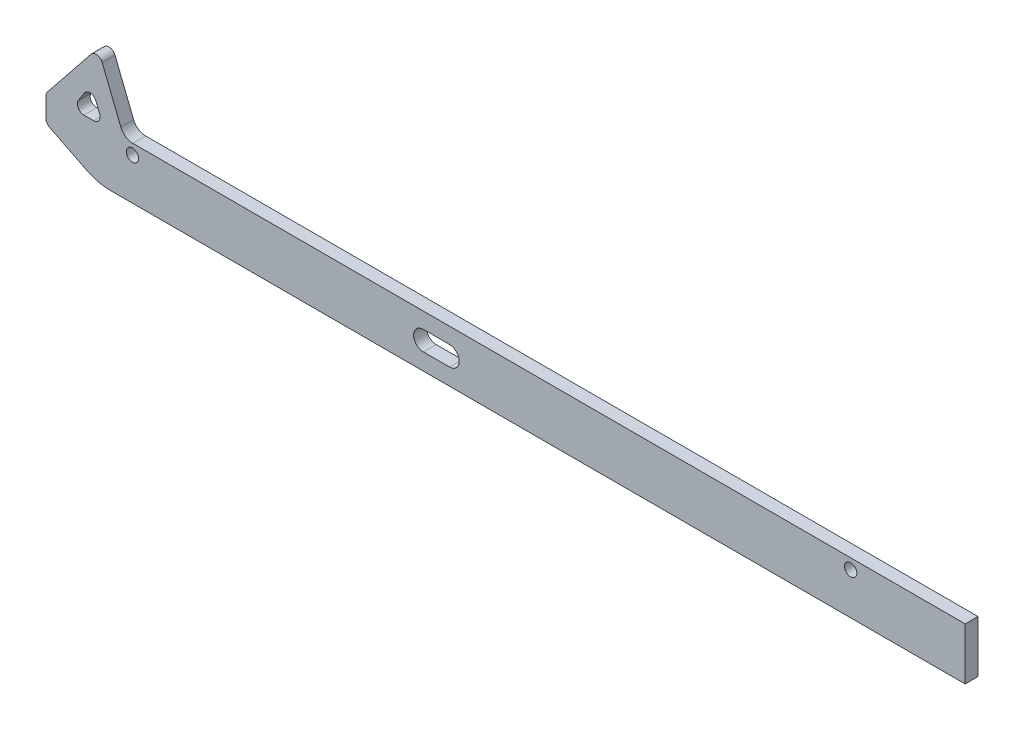
ISO-10303-21;
HEADER;
FILE_DESCRIPTION(('STEP AP214'),'2;1');
FILE_NAME('part.step','',(''),(''),'','','');
FILE_SCHEMA(('AUTOMOTIVE_DESIGN { 1 0 10303 214 1 1 1 1 }'));
ENDSEC;
DATA;
#1=APPLICATION_CONTEXT('core data for automotive mechanical design processes');
#2=APPLICATION_PROTOCOL_DEFINITION('international standard','automotive_design',2000,#1);
#3=PRODUCT_CONTEXT('',#1,'mechanical');
#4=PRODUCT('Part','Part','',(#3));
#5=PRODUCT_RELATED_PRODUCT_CATEGORY('part','',(#4));
#6=PRODUCT_DEFINITION_FORMATION('','',#4);
#7=PRODUCT_DEFINITION_CONTEXT('part definition',#1,'design');
#8=PRODUCT_DEFINITION('design','',#6,#7);
#9=PRODUCT_DEFINITION_SHAPE('','',#8);
#10=(LENGTH_UNIT() NAMED_UNIT(*) SI_UNIT(.MILLI.,.METRE.));
#11=(NAMED_UNIT(*) PLANE_ANGLE_UNIT() SI_UNIT($,.RADIAN.));
#12=(NAMED_UNIT(*) SI_UNIT($,.STERADIAN.) SOLID_ANGLE_UNIT());
#13=UNCERTAINTY_MEASURE_WITH_UNIT(LENGTH_MEASURE(1.E-05),#10,'distance_accuracy_value','');
#14=(GEOMETRIC_REPRESENTATION_CONTEXT(3) GLOBAL_UNCERTAINTY_ASSIGNED_CONTEXT((#13)) GLOBAL_UNIT_ASSIGNED_CONTEXT((#10,
#11,#12)) REPRESENTATION_CONTEXT('',''));
#15=CARTESIAN_POINT('',(0.,0.,0.));
#16=DIRECTION('',(0.,0.,1.));
#17=DIRECTION('',(1.,0.,0.));
#18=AXIS2_PLACEMENT_3D('',#15,#16,#17);
#19=CARTESIAN_POINT('',(0.,0.,3.1242));
#20=DIRECTION('',(0.,0.,-1.));
#21=DIRECTION('',(-1.,0.,0.));
#22=AXIS2_PLACEMENT_3D('',#19,#20,#21);
#23=PLANE('',#22);
#24=CARTESIAN_POINT('',(-89.4001670845151,3.71634930325884,3.1242));
#25=DIRECTION('',(0.,0.,1.));
#26=DIRECTION('',(1.,0.,0.));
#27=AXIS2_PLACEMENT_3D('',#24,#25,#26);
#28=CIRCLE('',#27,1.5);
#29=CARTESIAN_POINT('',(-87.9001670845151,3.71634930325884,3.1242));
#30=VERTEX_POINT('',#29);
#31=EDGE_CURVE('E647',#30,#30,#28,.T.);
#32=ORIENTED_EDGE('',*,*,#31,.F.);
#33=EDGE_LOOP('',(#32));
#34=FACE_BOUND('',#33,.T.);
#35=CARTESIAN_POINT('',(85.8598329154849,3.71634930325885,3.1242));
#36=DIRECTION('',(0.,0.,1.));
#37=DIRECTION('',(1.,0.,0.));
#38=AXIS2_PLACEMENT_3D('',#35,#36,#37);
#39=CIRCLE('',#38,1.5);
#40=CARTESIAN_POINT('',(87.3598329154849,3.71634930325885,3.1242));
#41=VERTEX_POINT('',#40);
#42=EDGE_CURVE('E207',#41,#41,#39,.T.);
#43=ORIENTED_EDGE('',*,*,#42,.F.);
#44=EDGE_LOOP('',(#43));
#45=FACE_BOUND('',#44,.T.);
#46=DIRECTION('',(1.,0.,0.));
#47=VECTOR('',#46,1.);
#48=CARTESIAN_POINT('',(-18.4071670845151,-2.38125,3.1242));
#49=LINE('',#48,#47);
#50=CARTESIAN_POINT('',(-18.4071670845151,-2.38125,3.1242));
#51=VERTEX_POINT('',#50);
#52=CARTESIAN_POINT('',(-12.0571670845151,-2.38125,3.1242));
#53=VERTEX_POINT('',#52);
#54=EDGE_CURVE('E213',#51,#53,#49,.T.);
#55=ORIENTED_EDGE('',*,*,#54,.F.);
#56=CARTESIAN_POINT('',(-18.4071670845151,0.,3.1242));
#57=DIRECTION('',(0.,0.,1.));
#58=DIRECTION('',(1.,0.,0.));
#59=AXIS2_PLACEMENT_3D('',#56,#57,#58);
#60=CIRCLE('',#59,2.38125);
#61=CARTESIAN_POINT('',(-18.4071670845151,2.38125,3.1242));
#62=VERTEX_POINT('',#61);
#63=EDGE_CURVE('E50',#62,#51,#60,.T.);
#64=ORIENTED_EDGE('',*,*,#63,.F.);
#65=DIRECTION('',(-1.,0.,0.));
#66=VECTOR('',#65,1.);
#67=CARTESIAN_POINT('',(-18.4071670845151,2.38125,3.1242));
#68=LINE('',#67,#66);
#69=CARTESIAN_POINT('',(-12.0571670845151,2.38125,3.1242));
#70=VERTEX_POINT('',#69);
#71=EDGE_CURVE('E201',#70,#62,#68,.T.);
#72=ORIENTED_EDGE('',*,*,#71,.F.);
#73=CARTESIAN_POINT('',(-12.0571670845151,0.,3.1242));
#74=DIRECTION('',(0.,0.,1.));
#75=DIRECTION('',(1.,0.,0.));
#76=AXIS2_PLACEMENT_3D('',#73,#74,#75);
#77=CIRCLE('',#76,2.38125);
#78=EDGE_CURVE('E204',#53,#70,#77,.T.);
#79=ORIENTED_EDGE('',*,*,#78,.F.);
#80=EDGE_LOOP('',(#55,#64,#72,#79));
#81=FACE_BOUND('',#80,.T.);
#82=DIRECTION('',(0.,-1.,0.));
#83=VECTOR('',#82,1.);
#84=CARTESIAN_POINT('',(-110.491946084515,6.25634930325885,3.1242));
#85=LINE('',#84,#83);
#86=CARTESIAN_POINT('',(-110.491946084515,5.69948437152769,3.1242));
#87=VERTEX_POINT('',#86);
#88=CARTESIAN_POINT('',(-110.491946084515,0.887478260399303,3.1242));
#89=VERTEX_POINT('',#88);
#90=EDGE_CURVE('E242',#87,#89,#85,.T.);
#91=ORIENTED_EDGE('',*,*,#90,.T.);
#92=CARTESIAN_POINT('',(-108.904446084515,0.887478260399303,3.1242));
#93=DIRECTION('',(0.,0.,-1.));
#94=DIRECTION('',(-1.,0.,0.));
#95=AXIS2_PLACEMENT_3D('',#92,#93,#94);
#96=CIRCLE('',#95,1.5875);
#97=CARTESIAN_POINT('',(-109.614397667371,-0.532424905313064,3.1242));
#98=VERTEX_POINT('',#97);
#99=EDGE_CURVE('E311',#89,#98,#96,.F.);
#100=ORIENTED_EDGE('',*,*,#99,.T.);
#101=DIRECTION('',(0.894427190999916,-0.447213595499958,0.));
#102=VECTOR('',#101,1.);
#103=CARTESIAN_POINT('',(-110.491946084515,-0.0936506967411516,3.1242));
#104=LINE('',#103,#102);
#105=CARTESIAN_POINT('',(-100.473495433117,-5.10287602244007,3.1242));
#106=VERTEX_POINT('',#105);
#107=EDGE_CURVE('E245',#98,#106,#104,.T.);
#108=ORIENTED_EDGE('',*,*,#107,.T.);
#109=CARTESIAN_POINT('',(-94.7938827702678,6.25634930325885,3.1242));
#110=DIRECTION('',(0.,0.,-1.));
#111=DIRECTION('',(-1.,0.,0.));
#112=AXIS2_PLACEMENT_3D('',#109,#110,#111);
#113=CIRCLE('',#112,12.7);
#114=CARTESIAN_POINT('',(-94.7938827702678,-6.44365069674115,3.1242));
#115=VERTEX_POINT('',#114);
#116=EDGE_CURVE('E290',#106,#115,#113,.F.);
#117=ORIENTED_EDGE('',*,*,#116,.T.);
#118=DIRECTION('',(1.,0.,0.));
#119=VECTOR('',#118,1.);
#120=CARTESIAN_POINT('',(113.799832915485,-6.44365069674112,3.1242));
#121=LINE('',#120,#119);
#122=CARTESIAN_POINT('',(113.799832915485,-6.44365069674112,3.1242));
#123=VERTEX_POINT('',#122);
#124=EDGE_CURVE('E248',#115,#123,#121,.T.);
#125=ORIENTED_EDGE('',*,*,#124,.T.);
#126=DIRECTION('',(0.,1.,0.));
#127=VECTOR('',#126,1.);
#128=CARTESIAN_POINT('',(113.799832915485,-6.44365069674112,3.1242));
#129=LINE('',#128,#127);
#130=CARTESIAN_POINT('',(113.799832915485,6.25634930325888,3.1242));
#131=VERTEX_POINT('',#130);
#132=EDGE_CURVE('E250',#123,#131,#129,.T.);
#133=ORIENTED_EDGE('',*,*,#132,.T.);
#134=DIRECTION('',(-1.,0.,0.));
#135=VECTOR('',#134,1.);
#136=CARTESIAN_POINT('',(113.799832915485,6.25634930325888,3.1242));
#137=LINE('',#136,#135);
#138=CARTESIAN_POINT('',(-89.2923664319847,6.25634930325885,3.1242));
#139=VERTEX_POINT('',#138);
#140=EDGE_CURVE('E252',#131,#139,#137,.T.);
#141=ORIENTED_EDGE('',*,*,#140,.T.);
#142=CARTESIAN_POINT('',(-89.2923664319847,9.43134930325885,3.1242));
#143=DIRECTION('',(0.,0.,-1.));
#144=DIRECTION('',(-1.,0.,0.));
#145=AXIS2_PLACEMENT_3D('',#142,#143,#144);
#146=CIRCLE('',#145,3.175);
#147=CARTESIAN_POINT('',(-92.2402799255454,8.25218390583457,3.1242));
#148=VERTEX_POINT('',#147);
#149=EDGE_CURVE('E11',#139,#148,#146,.T.);
#150=ORIENTED_EDGE('',*,*,#149,.T.);
#151=DIRECTION('',(-0.371390676354104,0.928476690885259,0.));
#152=VECTOR('',#151,1.);
#153=CARTESIAN_POINT('',(-97.7919460845151,22.1313493032588,3.1242));
#154=LINE('',#153,#152);
#155=CARTESIAN_POINT('',(-96.7801852401166,19.6019471922625,3.1242));
#156=VERTEX_POINT('',#155);
#157=EDGE_CURVE('E255',#148,#156,#154,.T.);
#158=ORIENTED_EDGE('',*,*,#157,.T.);
#159=CARTESIAN_POINT('',(-98.2541419868969,19.0123644935504,3.1242));
#160=DIRECTION('',(0.,0.,-1.));
#161=DIRECTION('',(-1.,0.,0.));
#162=AXIS2_PLACEMENT_3D('',#159,#160,#161);
#163=CIRCLE('',#162,1.5875);
#164=CARTESIAN_POINT('',(-99.4937712218877,20.0040678815431,3.1242));
#165=VERTEX_POINT('',#164);
#166=EDGE_CURVE('E307',#156,#165,#163,.F.);
#167=ORIENTED_EDGE('',*,*,#166,.T.);
#168=DIRECTION('',(-0.624695047554425,-0.78086880944303,0.));
#169=VECTOR('',#168,1.);
#170=CARTESIAN_POINT('',(-97.7919460845151,22.1313493032588,3.1242));
#171=LINE('',#170,#169);
#172=CARTESIAN_POINT('',(-110.144075319506,6.69118775952035,3.1242));
#173=VERTEX_POINT('',#172);
#174=EDGE_CURVE('E257',#165,#173,#171,.T.);
#175=ORIENTED_EDGE('',*,*,#174,.T.);
#176=CARTESIAN_POINT('',(-108.904446084515,5.69948437152769,3.1242));
#177=DIRECTION('',(0.,0.,-1.));
#178=DIRECTION('',(-1.,0.,0.));
#179=AXIS2_PLACEMENT_3D('',#176,#177,#178);
#180=CIRCLE('',#179,1.5875);
#181=EDGE_CURVE('E309',#173,#87,#180,.F.);
#182=ORIENTED_EDGE('',*,*,#181,.T.);
#183=EDGE_LOOP('',(#91,#100,#108,#117,#125,#133,#141,#150,#158,#167,#175,#182));
#184=FACE_BOUND('',#183,.T.);
#185=DIRECTION('',(1.,0.,0.));
#186=VECTOR('',#185,1.);
#187=CARTESIAN_POINT('',(-96.5219460845151,6.25634930325887,3.1242));
#188=LINE('',#187,#186);
#189=CARTESIAN_POINT('',(-101.248130981358,6.25634930325888,3.1242));
#190=VERTEX_POINT('',#189);
#191=CARTESIAN_POINT('',(-98.8667359107803,6.25634930325888,3.1242));
#192=VERTEX_POINT('',#191);
#193=EDGE_CURVE('E224',#190,#192,#188,.T.);
#194=ORIENTED_EDGE('',*,*,#193,.F.);
#195=CARTESIAN_POINT('',(-101.248130981358,7.84384930325888,3.1242));
#196=DIRECTION('',(0.,0.,-1.));
#197=DIRECTION('',(-1.,0.,0.));
#198=AXIS2_PLACEMENT_3D('',#195,#196,#197);
#199=CIRCLE('',#198,1.5875);
#200=CARTESIAN_POINT('',(-102.586968983535,8.69688450412992,3.1242));
#201=VERTEX_POINT('',#200);
#202=EDGE_CURVE('E342',#190,#201,#199,.T.);
#203=ORIENTED_EDGE('',*,*,#202,.T.);
#204=DIRECTION('',(-0.537345008422703,-0.843362521056755,0.));
#205=VECTOR('',#204,1.);
#206=CARTESIAN_POINT('',(-104.141946084515,6.25634930325888,3.1242));
#207=LINE('',#206,#205);
#208=CARTESIAN_POINT('',(-101.124015560479,10.9929886229325,3.1242));
#209=VERTEX_POINT('',#208);
#210=EDGE_CURVE('E231',#209,#201,#207,.T.);
#211=ORIENTED_EDGE('',*,*,#210,.F.);
#212=CARTESIAN_POINT('',(-99.7851775583013,10.1399534220614,3.1242));
#213=DIRECTION('',(0.,0.,-1.));
#214=DIRECTION('',(-1.,0.,0.));
#215=AXIS2_PLACEMENT_3D('',#212,#213,#214);
#216=CIRCLE('',#215,1.5875);
#217=CARTESIAN_POINT('',(-98.311220811521,10.7295361207735,3.1242));
#218=VERTEX_POINT('',#217);
#219=EDGE_CURVE('E338',#209,#218,#216,.T.);
#220=ORIENTED_EDGE('',*,*,#219,.T.);
#221=DIRECTION('',(-0.371390676354104,0.928476690885259,0.));
#222=VECTOR('',#221,1.);
#223=CARTESIAN_POINT('',(-99.4607803168433,13.6034348840793,3.1242));
#224=LINE('',#223,#222);
#225=CARTESIAN_POINT('',(-97.3927791639999,8.43343200197101,3.1242));
#226=VERTEX_POINT('',#225);
#227=EDGE_CURVE('E227',#226,#218,#224,.T.);
#228=ORIENTED_EDGE('',*,*,#227,.F.);
#229=CARTESIAN_POINT('',(-98.8667359107803,7.84384930325887,3.1242));
#230=DIRECTION('',(0.,0.,-1.));
#231=DIRECTION('',(-1.,0.,0.));
#232=AXIS2_PLACEMENT_3D('',#229,#230,#231);
#233=CIRCLE('',#232,1.5875);
#234=EDGE_CURVE('E346',#226,#192,#233,.T.);
#235=ORIENTED_EDGE('',*,*,#234,.T.);
#236=EDGE_LOOP('',(#194,#203,#211,#220,#228,#235));
#237=FACE_BOUND('',#236,.T.);
#238=ADVANCED_FACE('F35',(#34,#45,#81,#184,#237),#23,.F.);
#239=CARTESIAN_POINT('',(0.,0.,0.));
#240=DIRECTION('',(0.,0.,-1.));
#241=DIRECTION('',(-1.,0.,0.));
#242=AXIS2_PLACEMENT_3D('',#239,#240,#241);
#243=PLANE('',#242);
#244=CARTESIAN_POINT('',(-89.4001670845151,3.71634930325884,0.));
#245=DIRECTION('',(0.,0.,1.));
#246=DIRECTION('',(1.,0.,0.));
#247=AXIS2_PLACEMENT_3D('',#244,#245,#246);
#248=CIRCLE('',#247,1.5);
#249=CARTESIAN_POINT('',(-87.9001670845151,3.71634930325884,0.));
#250=VERTEX_POINT('',#249);
#251=EDGE_CURVE('E645',#250,#250,#248,.T.);
#252=ORIENTED_EDGE('',*,*,#251,.T.);
#253=EDGE_LOOP('',(#252));
#254=FACE_BOUND('',#253,.T.);
#255=CARTESIAN_POINT('',(85.8598329154849,3.71634930325885,0.));
#256=DIRECTION('',(0.,0.,1.));
#257=DIRECTION('',(1.,0.,0.));
#258=AXIS2_PLACEMENT_3D('',#255,#256,#257);
#259=CIRCLE('',#258,1.5);
#260=CARTESIAN_POINT('',(87.3598329154849,3.71634930325885,0.));
#261=VERTEX_POINT('',#260);
#262=EDGE_CURVE('E214',#261,#261,#259,.T.);
#263=ORIENTED_EDGE('',*,*,#262,.T.);
#264=EDGE_LOOP('',(#263));
#265=FACE_BOUND('',#264,.T.);
#266=CARTESIAN_POINT('',(-18.4071670845151,0.,0.));
#267=DIRECTION('',(0.,0.,1.));
#268=DIRECTION('',(1.,0.,0.));
#269=AXIS2_PLACEMENT_3D('',#266,#267,#268);
#270=CIRCLE('',#269,2.38125);
#271=CARTESIAN_POINT('',(-18.4071670845151,2.38125,0.));
#272=VERTEX_POINT('',#271);
#273=CARTESIAN_POINT('',(-18.4071670845151,-2.38125,0.));
#274=VERTEX_POINT('',#273);
#275=EDGE_CURVE('E185',#272,#274,#270,.T.);
#276=ORIENTED_EDGE('',*,*,#275,.T.);
#277=DIRECTION('',(1.,0.,0.));
#278=VECTOR('',#277,1.);
#279=CARTESIAN_POINT('',(-18.4071670845151,-2.38125,0.));
#280=LINE('',#279,#278);
#281=CARTESIAN_POINT('',(-12.0571670845151,-2.38125,0.));
#282=VERTEX_POINT('',#281);
#283=EDGE_CURVE('E194',#274,#282,#280,.T.);
#284=ORIENTED_EDGE('',*,*,#283,.T.);
#285=CARTESIAN_POINT('',(-12.0571670845151,0.,0.));
#286=DIRECTION('',(0.,0.,1.));
#287=DIRECTION('',(1.,0.,0.));
#288=AXIS2_PLACEMENT_3D('',#285,#286,#287);
#289=CIRCLE('',#288,2.38125);
#290=CARTESIAN_POINT('',(-12.0571670845151,2.38125,0.));
#291=VERTEX_POINT('',#290);
#292=EDGE_CURVE('E58',#282,#291,#289,.T.);
#293=ORIENTED_EDGE('',*,*,#292,.T.);
#294=DIRECTION('',(-1.,0.,0.));
#295=VECTOR('',#294,1.);
#296=CARTESIAN_POINT('',(-18.4071670845151,2.38125,0.));
#297=LINE('',#296,#295);
#298=EDGE_CURVE('E191',#291,#272,#297,.T.);
#299=ORIENTED_EDGE('',*,*,#298,.T.);
#300=EDGE_LOOP('',(#276,#284,#293,#299));
#301=FACE_BOUND('',#300,.T.);
#302=DIRECTION('',(0.894427190999916,-0.447213595499958,0.));
#303=VECTOR('',#302,1.);
#304=CARTESIAN_POINT('',(-110.491946084515,-0.0936506967411516,0.));
#305=LINE('',#304,#303);
#306=CARTESIAN_POINT('',(-109.614397667371,-0.532424905313064,0.));
#307=VERTEX_POINT('',#306);
#308=CARTESIAN_POINT('',(-100.473495433117,-5.10287602244007,0.));
#309=VERTEX_POINT('',#308);
#310=EDGE_CURVE('E263',#307,#309,#305,.T.);
#311=ORIENTED_EDGE('',*,*,#310,.F.);
#312=CARTESIAN_POINT('',(-108.904446084515,0.887478260399303,0.));
#313=DIRECTION('',(0.,0.,-1.));
#314=DIRECTION('',(-1.,0.,0.));
#315=AXIS2_PLACEMENT_3D('',#312,#313,#314);
#316=CIRCLE('',#315,1.5875);
#317=CARTESIAN_POINT('',(-110.491946084515,0.887478260399303,0.));
#318=VERTEX_POINT('',#317);
#319=EDGE_CURVE('E300',#307,#318,#316,.T.);
#320=ORIENTED_EDGE('',*,*,#319,.T.);
#321=DIRECTION('',(0.,-1.,0.));
#322=VECTOR('',#321,1.);
#323=CARTESIAN_POINT('',(-110.491946084515,6.25634930325885,0.));
#324=LINE('',#323,#322);
#325=CARTESIAN_POINT('',(-110.491946084515,5.69948437152769,0.));
#326=VERTEX_POINT('',#325);
#327=EDGE_CURVE('E234',#326,#318,#324,.T.);
#328=ORIENTED_EDGE('',*,*,#327,.F.);
#329=CARTESIAN_POINT('',(-108.904446084515,5.69948437152769,0.));
#330=DIRECTION('',(0.,0.,-1.));
#331=DIRECTION('',(-1.,0.,0.));
#332=AXIS2_PLACEMENT_3D('',#329,#330,#331);
#333=CIRCLE('',#332,1.5875);
#334=CARTESIAN_POINT('',(-110.144075319506,6.69118775952035,0.));
#335=VERTEX_POINT('',#334);
#336=EDGE_CURVE('E298',#326,#335,#333,.T.);
#337=ORIENTED_EDGE('',*,*,#336,.T.);
#338=DIRECTION('',(-0.624695047554425,-0.78086880944303,0.));
#339=VECTOR('',#338,1.);
#340=CARTESIAN_POINT('',(-97.7919460845151,22.1313493032588,0.));
#341=LINE('',#340,#339);
#342=CARTESIAN_POINT('',(-99.4937712218877,20.0040678815431,0.));
#343=VERTEX_POINT('',#342);
#344=EDGE_CURVE('E246',#343,#335,#341,.T.);
#345=ORIENTED_EDGE('',*,*,#344,.F.);
#346=CARTESIAN_POINT('',(-98.2541419868969,19.0123644935504,0.));
#347=DIRECTION('',(0.,0.,-1.));
#348=DIRECTION('',(-1.,0.,0.));
#349=AXIS2_PLACEMENT_3D('',#346,#347,#348);
#350=CIRCLE('',#349,1.5875);
#351=CARTESIAN_POINT('',(-96.7801852401166,19.6019471922625,0.));
#352=VERTEX_POINT('',#351);
#353=EDGE_CURVE('E295',#343,#352,#350,.T.);
#354=ORIENTED_EDGE('',*,*,#353,.T.);
#355=DIRECTION('',(-0.371390676354104,0.928476690885259,0.));
#356=VECTOR('',#355,1.);
#357=CARTESIAN_POINT('',(-97.7919460845151,22.1313493032588,0.));
#358=LINE('',#357,#356);
#359=CARTESIAN_POINT('',(-92.2402799255454,8.25218390583457,0.));
#360=VERTEX_POINT('',#359);
#361=EDGE_CURVE('E272',#360,#352,#358,.T.);
#362=ORIENTED_EDGE('',*,*,#361,.F.);
#363=CARTESIAN_POINT('',(-89.2923664319847,9.43134930325885,0.));
#364=DIRECTION('',(0.,0.,-1.));
#365=DIRECTION('',(-1.,0.,0.));
#366=AXIS2_PLACEMENT_3D('',#363,#364,#365);
#367=CIRCLE('',#366,3.175);
#368=CARTESIAN_POINT('',(-89.2923664319847,6.25634930325885,0.));
#369=VERTEX_POINT('',#368);
#370=EDGE_CURVE('E43',#360,#369,#367,.F.);
#371=ORIENTED_EDGE('',*,*,#370,.T.);
#372=DIRECTION('',(-1.,0.,0.));
#373=VECTOR('',#372,1.);
#374=CARTESIAN_POINT('',(113.799832915485,6.25634930325888,0.));
#375=LINE('',#374,#373);
#376=CARTESIAN_POINT('',(113.799832915485,6.25634930325888,0.));
#377=VERTEX_POINT('',#376);
#378=EDGE_CURVE('E269',#377,#369,#375,.T.);
#379=ORIENTED_EDGE('',*,*,#378,.F.);
#380=DIRECTION('',(0.,1.,0.));
#381=VECTOR('',#380,1.);
#382=CARTESIAN_POINT('',(113.799832915485,-6.44365069674112,0.));
#383=LINE('',#382,#381);
#384=CARTESIAN_POINT('',(113.799832915485,-6.44365069674112,0.));
#385=VERTEX_POINT('',#384);
#386=EDGE_CURVE('E267',#385,#377,#383,.T.);
#387=ORIENTED_EDGE('',*,*,#386,.F.);
#388=DIRECTION('',(1.,0.,0.));
#389=VECTOR('',#388,1.);
#390=CARTESIAN_POINT('',(113.799832915485,-6.44365069674112,0.));
#391=LINE('',#390,#389);
#392=CARTESIAN_POINT('',(-94.7938827702678,-6.44365069674115,0.));
#393=VERTEX_POINT('',#392);
#394=EDGE_CURVE('E265',#393,#385,#391,.T.);
#395=ORIENTED_EDGE('',*,*,#394,.F.);
#396=CARTESIAN_POINT('',(-94.7938827702678,6.25634930325885,0.));
#397=DIRECTION('',(0.,0.,-1.));
#398=DIRECTION('',(-1.,0.,0.));
#399=AXIS2_PLACEMENT_3D('',#396,#397,#398);
#400=CIRCLE('',#399,12.7);
#401=EDGE_CURVE('E284',#393,#309,#400,.T.);
#402=ORIENTED_EDGE('',*,*,#401,.T.);
#403=EDGE_LOOP('',(#311,#320,#328,#337,#345,#354,#362,#371,#379,#387,#395,#402));
#404=FACE_BOUND('',#403,.T.);
#405=DIRECTION('',(-0.371390676354104,0.928476690885259,0.));
#406=VECTOR('',#405,1.);
#407=CARTESIAN_POINT('',(-99.4607803168433,13.6034348840793,0.));
#408=LINE('',#407,#406);
#409=CARTESIAN_POINT('',(-97.3927791639999,8.43343200197101,0.));
#410=VERTEX_POINT('',#409);
#411=CARTESIAN_POINT('',(-98.311220811521,10.7295361207735,0.));
#412=VERTEX_POINT('',#411);
#413=EDGE_CURVE('E237',#410,#412,#408,.T.);
#414=ORIENTED_EDGE('',*,*,#413,.T.);
#415=CARTESIAN_POINT('',(-99.7851775583013,10.1399534220614,0.));
#416=DIRECTION('',(0.,0.,-1.));
#417=DIRECTION('',(-1.,0.,0.));
#418=AXIS2_PLACEMENT_3D('',#415,#416,#417);
#419=CIRCLE('',#418,1.5875);
#420=CARTESIAN_POINT('',(-101.124015560479,10.9929886229325,0.));
#421=VERTEX_POINT('',#420);
#422=EDGE_CURVE('E336',#412,#421,#419,.F.);
#423=ORIENTED_EDGE('',*,*,#422,.T.);
#424=DIRECTION('',(-0.537345008422703,-0.843362521056755,0.));
#425=VECTOR('',#424,1.);
#426=CARTESIAN_POINT('',(-104.141946084515,6.25634930325888,0.));
#427=LINE('',#426,#425);
#428=CARTESIAN_POINT('',(-102.586968983535,8.69688450412992,0.));
#429=VERTEX_POINT('',#428);
#430=EDGE_CURVE('E228',#421,#429,#427,.T.);
#431=ORIENTED_EDGE('',*,*,#430,.T.);
#432=CARTESIAN_POINT('',(-101.248130981358,7.84384930325888,0.));
#433=DIRECTION('',(0.,0.,-1.));
#434=DIRECTION('',(-1.,0.,0.));
#435=AXIS2_PLACEMENT_3D('',#432,#433,#434);
#436=CIRCLE('',#435,1.5875);
#437=CARTESIAN_POINT('',(-101.248130981358,6.25634930325888,0.));
#438=VERTEX_POINT('',#437);
#439=EDGE_CURVE('E340',#429,#438,#436,.F.);
#440=ORIENTED_EDGE('',*,*,#439,.T.);
#441=DIRECTION('',(1.,0.,0.));
#442=VECTOR('',#441,1.);
#443=CARTESIAN_POINT('',(-96.5219460845151,6.25634930325887,0.));
#444=LINE('',#443,#442);
#445=CARTESIAN_POINT('',(-98.8667359107803,6.25634930325888,0.));
#446=VERTEX_POINT('',#445);
#447=EDGE_CURVE('E220',#438,#446,#444,.T.);
#448=ORIENTED_EDGE('',*,*,#447,.T.);
#449=CARTESIAN_POINT('',(-98.8667359107803,7.84384930325887,0.));
#450=DIRECTION('',(0.,0.,-1.));
#451=DIRECTION('',(-1.,0.,0.));
#452=AXIS2_PLACEMENT_3D('',#449,#450,#451);
#453=CIRCLE('',#452,1.5875);
#454=EDGE_CURVE('E344',#446,#410,#453,.F.);
#455=ORIENTED_EDGE('',*,*,#454,.T.);
#456=EDGE_LOOP('',(#414,#423,#431,#440,#448,#455));
#457=FACE_BOUND('',#456,.T.);
#458=ADVANCED_FACE('F198',(#254,#265,#301,#404,#457),#243,.T.);
#459=CARTESIAN_POINT('',(-110.491946084515,6.25634930325885,3.1242));
#460=DIRECTION('',(1.,0.,0.));
#461=DIRECTION('',(0.,0.,-1.));
#462=AXIS2_PLACEMENT_3D('',#459,#460,#461);
#463=PLANE('',#462);
#464=ORIENTED_EDGE('',*,*,#327,.T.);
#465=DIRECTION('',(0.,0.,-1.));
#466=VECTOR('',#465,1.);
#467=CARTESIAN_POINT('',(-110.491946084515,0.887478260399303,3.1242));
#468=LINE('',#467,#466);
#469=EDGE_CURVE('E305',#318,#89,#468,.F.);
#470=ORIENTED_EDGE('',*,*,#469,.T.);
#471=ORIENTED_EDGE('',*,*,#90,.F.);
#472=DIRECTION('',(0.,0.,-1.));
#473=VECTOR('',#472,1.);
#474=CARTESIAN_POINT('',(-110.491946084515,5.69948437152769,3.1242));
#475=LINE('',#474,#473);
#476=EDGE_CURVE('E302',#87,#326,#475,.T.);
#477=ORIENTED_EDGE('',*,*,#476,.T.);
#478=EDGE_LOOP('',(#464,#470,#471,#477));
#479=FACE_BOUND('',#478,.T.);
#480=ADVANCED_FACE('F387',(#479),#463,.F.);
#481=CARTESIAN_POINT('',(-110.491946084515,-0.0936506967411516,3.1242));
#482=DIRECTION('',(0.447213595499958,0.894427190999916,0.));
#483=DIRECTION('',(-0.894427190999916,0.447213595499958,0.));
#484=AXIS2_PLACEMENT_3D('',#481,#482,#483);
#485=PLANE('',#484);
#486=ORIENTED_EDGE('',*,*,#107,.F.);
#487=DIRECTION('',(0.,0.,-1.));
#488=VECTOR('',#487,1.);
#489=CARTESIAN_POINT('',(-109.614397667371,-0.532424905313064,3.1242));
#490=LINE('',#489,#488);
#491=EDGE_CURVE('E292',#98,#307,#490,.T.);
#492=ORIENTED_EDGE('',*,*,#491,.T.);
#493=ORIENTED_EDGE('',*,*,#310,.T.);
#494=DIRECTION('',(0.,0.,-1.));
#495=VECTOR('',#494,1.);
#496=CARTESIAN_POINT('',(-100.473495433117,-5.10287602244007,3.1242));
#497=LINE('',#496,#495);
#498=EDGE_CURVE('E287',#309,#106,#497,.F.);
#499=ORIENTED_EDGE('',*,*,#498,.T.);
#500=EDGE_LOOP('',(#486,#492,#493,#499));
#501=FACE_BOUND('',#500,.T.);
#502=ADVANCED_FACE('F395',(#501),#485,.F.);
#503=CARTESIAN_POINT('',(113.799832915485,-6.44365069674112,3.1242));
#504=DIRECTION('',(0.,1.,0.));
#505=DIRECTION('',(-1.,0.,0.));
#506=AXIS2_PLACEMENT_3D('',#503,#504,#505);
#507=PLANE('',#506);
#508=ORIENTED_EDGE('',*,*,#124,.F.);
#509=DIRECTION('',(0.,0.,-1.));
#510=VECTOR('',#509,1.);
#511=CARTESIAN_POINT('',(-94.7938827702678,-6.44365069674115,3.1242));
#512=LINE('',#511,#510);
#513=EDGE_CURVE('E281',#115,#393,#512,.T.);
#514=ORIENTED_EDGE('',*,*,#513,.T.);
#515=ORIENTED_EDGE('',*,*,#394,.T.);
#516=DIRECTION('',(0.,0.,-1.));
#517=VECTOR('',#516,1.);
#518=CARTESIAN_POINT('',(113.799832915485,-6.44365069674112,3.1242));
#519=LINE('',#518,#517);
#520=EDGE_CURVE('E278',#123,#385,#519,.T.);
#521=ORIENTED_EDGE('',*,*,#520,.F.);
#522=EDGE_LOOP('',(#508,#514,#515,#521));
#523=FACE_BOUND('',#522,.T.);
#524=ADVANCED_FACE('F404',(#523),#507,.F.);
#525=CARTESIAN_POINT('',(113.799832915485,-6.44365069674112,3.1242));
#526=DIRECTION('',(-1.,0.,0.));
#527=DIRECTION('',(0.,0.,1.));
#528=AXIS2_PLACEMENT_3D('',#525,#526,#527);
#529=PLANE('',#528);
#530=ORIENTED_EDGE('',*,*,#386,.T.);
#531=DIRECTION('',(0.,0.,-1.));
#532=VECTOR('',#531,1.);
#533=CARTESIAN_POINT('',(113.799832915485,6.25634930325888,3.1242));
#534=LINE('',#533,#532);
#535=EDGE_CURVE('E260',#131,#377,#534,.T.);
#536=ORIENTED_EDGE('',*,*,#535,.F.);
#537=ORIENTED_EDGE('',*,*,#132,.F.);
#538=ORIENTED_EDGE('',*,*,#520,.T.);
#539=EDGE_LOOP('',(#530,#536,#537,#538));
#540=FACE_BOUND('',#539,.T.);
#541=ADVANCED_FACE('F408',(#540),#529,.F.);
#542=CARTESIAN_POINT('',(113.799832915485,6.25634930325888,3.1242));
#543=DIRECTION('',(0.,-1.,0.));
#544=DIRECTION('',(1.,0.,0.));
#545=AXIS2_PLACEMENT_3D('',#542,#543,#544);
#546=PLANE('',#545);
#547=ORIENTED_EDGE('',*,*,#378,.T.);
#548=DIRECTION('',(0.,0.,-1.));
#549=VECTOR('',#548,1.);
#550=CARTESIAN_POINT('',(-89.2923664319847,6.25634930325885,3.1242));
#551=LINE('',#550,#549);
#552=EDGE_CURVE('E351',#369,#139,#551,.F.);
#553=ORIENTED_EDGE('',*,*,#552,.T.);
#554=ORIENTED_EDGE('',*,*,#140,.F.);
#555=ORIENTED_EDGE('',*,*,#535,.T.);
#556=EDGE_LOOP('',(#547,#553,#554,#555));
#557=FACE_BOUND('',#556,.T.);
#558=ADVANCED_FACE('F361',(#557),#546,.F.);
#559=CARTESIAN_POINT('',(-97.7919460845151,22.1313493032588,3.1242));
#560=DIRECTION('',(-0.92847669088526,-0.371390676354104,0.));
#561=DIRECTION('',(0.371390676354104,-0.928476690885259,0.));
#562=AXIS2_PLACEMENT_3D('',#559,#560,#561);
#563=PLANE('',#562);
#564=ORIENTED_EDGE('',*,*,#157,.F.);
#565=DIRECTION('',(0.,0.,-1.));
#566=VECTOR('',#565,1.);
#567=CARTESIAN_POINT('',(-92.2402799255454,8.25218390583457,0.));
#568=LINE('',#567,#566);
#569=EDGE_CURVE('E348',#148,#360,#568,.T.);
#570=ORIENTED_EDGE('',*,*,#569,.T.);
#571=ORIENTED_EDGE('',*,*,#361,.T.);
#572=DIRECTION('',(0.,0.,-1.));
#573=VECTOR('',#572,1.);
#574=CARTESIAN_POINT('',(-96.7801852401166,19.6019471922625,3.1242));
#575=LINE('',#574,#573);
#576=EDGE_CURVE('E318',#352,#156,#575,.F.);
#577=ORIENTED_EDGE('',*,*,#576,.T.);
#578=EDGE_LOOP('',(#564,#570,#571,#577));
#579=FACE_BOUND('',#578,.T.);
#580=ADVANCED_FACE('F369',(#579),#563,.F.);
#581=CARTESIAN_POINT('',(-97.7919460845151,22.1313493032588,3.1242));
#582=DIRECTION('',(0.78086880944303,-0.624695047554425,0.));
#583=DIRECTION('',(0.624695047554425,0.78086880944303,0.));
#584=AXIS2_PLACEMENT_3D('',#581,#582,#583);
#585=PLANE('',#584);
#586=ORIENTED_EDGE('',*,*,#344,.T.);
#587=DIRECTION('',(0.,0.,-1.));
#588=VECTOR('',#587,1.);
#589=CARTESIAN_POINT('',(-110.144075319506,6.69118775952034,3.1242));
#590=LINE('',#589,#588);
#591=EDGE_CURVE('E316',#335,#173,#590,.F.);
#592=ORIENTED_EDGE('',*,*,#591,.T.);
#593=ORIENTED_EDGE('',*,*,#174,.F.);
#594=DIRECTION('',(0.,0.,-1.));
#595=VECTOR('',#594,1.);
#596=CARTESIAN_POINT('',(-99.4937712218877,20.0040678815431,3.1242));
#597=LINE('',#596,#595);
#598=EDGE_CURVE('E313',#165,#343,#597,.T.);
#599=ORIENTED_EDGE('',*,*,#598,.T.);
#600=EDGE_LOOP('',(#586,#592,#593,#599));
#601=FACE_BOUND('',#600,.T.);
#602=ADVANCED_FACE('F378',(#601),#585,.F.);
#603=CARTESIAN_POINT('',(-96.5219460845151,6.25634930325887,3.1242));
#604=DIRECTION('',(0.,1.,0.));
#605=DIRECTION('',(-1.,0.,0.));
#606=AXIS2_PLACEMENT_3D('',#603,#604,#605);
#607=PLANE('',#606);
#608=ORIENTED_EDGE('',*,*,#447,.F.);
#609=DIRECTION('',(0.,0.,-1.));
#610=VECTOR('',#609,1.);
#611=CARTESIAN_POINT('',(-101.248130981358,6.25634930325888,3.1242));
#612=LINE('',#611,#610);
#613=EDGE_CURVE('E334',#438,#190,#612,.F.);
#614=ORIENTED_EDGE('',*,*,#613,.T.);
#615=ORIENTED_EDGE('',*,*,#193,.T.);
#616=DIRECTION('',(0.,0.,-1.));
#617=VECTOR('',#616,1.);
#618=CARTESIAN_POINT('',(-98.8667359107803,6.25634930325888,0.));
#619=LINE('',#618,#617);
#620=EDGE_CURVE('E331',#192,#446,#619,.T.);
#621=ORIENTED_EDGE('',*,*,#620,.T.);
#622=EDGE_LOOP('',(#608,#614,#615,#621));
#623=FACE_BOUND('',#622,.T.);
#624=ADVANCED_FACE('F428',(#623),#607,.T.);
#625=CARTESIAN_POINT('',(-99.4607803168433,13.6034348840793,3.1242));
#626=DIRECTION('',(-0.928476690885259,-0.371390676354104,0.));
#627=DIRECTION('',(0.371390676354104,-0.928476690885259,0.));
#628=AXIS2_PLACEMENT_3D('',#625,#626,#627);
#629=PLANE('',#628);
#630=ORIENTED_EDGE('',*,*,#227,.T.);
#631=DIRECTION('',(0.,0.,-1.));
#632=VECTOR('',#631,1.);
#633=CARTESIAN_POINT('',(-98.311220811521,10.7295361207735,0.));
#634=LINE('',#633,#632);
#635=EDGE_CURVE('E323',#218,#412,#634,.T.);
#636=ORIENTED_EDGE('',*,*,#635,.T.);
#637=ORIENTED_EDGE('',*,*,#413,.F.);
#638=DIRECTION('',(0.,0.,-1.));
#639=VECTOR('',#638,1.);
#640=CARTESIAN_POINT('',(-97.3927791639999,8.43343200197101,3.1242));
#641=LINE('',#640,#639);
#642=EDGE_CURVE('E321',#410,#226,#641,.F.);
#643=ORIENTED_EDGE('',*,*,#642,.T.);
#644=EDGE_LOOP('',(#630,#636,#637,#643));
#645=FACE_BOUND('',#644,.T.);
#646=ADVANCED_FACE('F450',(#645),#629,.T.);
#647=CARTESIAN_POINT('',(-104.141946084515,6.25634930325888,3.1242));
#648=DIRECTION('',(0.843362521056754,-0.537345008422703,0.));
#649=DIRECTION('',(0.537345008422703,0.843362521056755,0.));
#650=AXIS2_PLACEMENT_3D('',#647,#648,#649);
#651=PLANE('',#650);
#652=ORIENTED_EDGE('',*,*,#430,.F.);
#653=DIRECTION('',(0.,0.,-1.));
#654=VECTOR('',#653,1.);
#655=CARTESIAN_POINT('',(-101.124015560479,10.9929886229325,3.1242));
#656=LINE('',#655,#654);
#657=EDGE_CURVE('E329',#421,#209,#656,.F.);
#658=ORIENTED_EDGE('',*,*,#657,.T.);
#659=ORIENTED_EDGE('',*,*,#210,.T.);
#660=DIRECTION('',(0.,0.,-1.));
#661=VECTOR('',#660,1.);
#662=CARTESIAN_POINT('',(-102.586968983535,8.69688450412992,0.));
#663=LINE('',#662,#661);
#664=EDGE_CURVE('E326',#201,#429,#663,.T.);
#665=ORIENTED_EDGE('',*,*,#664,.T.);
#666=EDGE_LOOP('',(#652,#658,#659,#665));
#667=FACE_BOUND('',#666,.T.);
#668=ADVANCED_FACE('F457',(#667),#651,.T.);
#669=CARTESIAN_POINT('',(-94.7938827702678,6.25634930325885,3.1242));
#670=DIRECTION('',(0.,0.,-1.));
#671=DIRECTION('',(-1.,0.,0.));
#672=AXIS2_PLACEMENT_3D('',#669,#670,#671);
#673=CYLINDRICAL_SURFACE('',#672,12.7);
#674=ORIENTED_EDGE('',*,*,#116,.F.);
#675=ORIENTED_EDGE('',*,*,#498,.F.);
#676=ORIENTED_EDGE('',*,*,#401,.F.);
#677=ORIENTED_EDGE('',*,*,#513,.F.);
#678=EDGE_LOOP('',(#674,#675,#676,#677));
#679=FACE_BOUND('',#678,.T.);
#680=ADVANCED_FACE('F400',(#679),#673,.T.);
#681=CARTESIAN_POINT('',(-108.904446084515,0.887478260399303,3.1242));
#682=DIRECTION('',(0.,0.,-1.));
#683=DIRECTION('',(-1.,0.,0.));
#684=AXIS2_PLACEMENT_3D('',#681,#682,#683);
#685=CYLINDRICAL_SURFACE('',#684,1.5875);
#686=ORIENTED_EDGE('',*,*,#99,.F.);
#687=ORIENTED_EDGE('',*,*,#469,.F.);
#688=ORIENTED_EDGE('',*,*,#319,.F.);
#689=ORIENTED_EDGE('',*,*,#491,.F.);
#690=EDGE_LOOP('',(#686,#687,#688,#689));
#691=FACE_BOUND('',#690,.T.);
#692=ADVANCED_FACE('F391',(#691),#685,.T.);
#693=CARTESIAN_POINT('',(-108.904446084515,5.69948437152769,3.1242));
#694=DIRECTION('',(0.,0.,-1.));
#695=DIRECTION('',(-1.,0.,0.));
#696=AXIS2_PLACEMENT_3D('',#693,#694,#695);
#697=CYLINDRICAL_SURFACE('',#696,1.5875);
#698=ORIENTED_EDGE('',*,*,#181,.F.);
#699=ORIENTED_EDGE('',*,*,#591,.F.);
#700=ORIENTED_EDGE('',*,*,#336,.F.);
#701=ORIENTED_EDGE('',*,*,#476,.F.);
#702=EDGE_LOOP('',(#698,#699,#700,#701));
#703=FACE_BOUND('',#702,.T.);
#704=ADVANCED_FACE('F382',(#703),#697,.T.);
#705=CARTESIAN_POINT('',(-98.2541419868969,19.0123644935504,3.1242));
#706=DIRECTION('',(0.,0.,-1.));
#707=DIRECTION('',(-1.,0.,0.));
#708=AXIS2_PLACEMENT_3D('',#705,#706,#707);
#709=CYLINDRICAL_SURFACE('',#708,1.5875);
#710=ORIENTED_EDGE('',*,*,#166,.F.);
#711=ORIENTED_EDGE('',*,*,#576,.F.);
#712=ORIENTED_EDGE('',*,*,#353,.F.);
#713=ORIENTED_EDGE('',*,*,#598,.F.);
#714=EDGE_LOOP('',(#710,#711,#712,#713));
#715=FACE_BOUND('',#714,.T.);
#716=ADVANCED_FACE('F374',(#715),#709,.T.);
#717=CARTESIAN_POINT('',(-99.7851775583013,10.1399534220614,3.1242));
#718=DIRECTION('',(0.,0.,1.));
#719=DIRECTION('',(1.,0.,0.));
#720=AXIS2_PLACEMENT_3D('',#717,#718,#719);
#721=CYLINDRICAL_SURFACE('',#720,1.5875);
#722=ORIENTED_EDGE('',*,*,#219,.F.);
#723=ORIENTED_EDGE('',*,*,#657,.F.);
#724=ORIENTED_EDGE('',*,*,#422,.F.);
#725=ORIENTED_EDGE('',*,*,#635,.F.);
#726=EDGE_LOOP('',(#722,#723,#724,#725));
#727=FACE_BOUND('',#726,.T.);
#728=ADVANCED_FACE('F491',(#727),#721,.F.);
#729=CARTESIAN_POINT('',(-101.248130981358,7.84384930325888,3.1242));
#730=DIRECTION('',(0.,0.,1.));
#731=DIRECTION('',(1.,0.,0.));
#732=AXIS2_PLACEMENT_3D('',#729,#730,#731);
#733=CYLINDRICAL_SURFACE('',#732,1.5875);
#734=ORIENTED_EDGE('',*,*,#202,.F.);
#735=ORIENTED_EDGE('',*,*,#613,.F.);
#736=ORIENTED_EDGE('',*,*,#439,.F.);
#737=ORIENTED_EDGE('',*,*,#664,.F.);
#738=EDGE_LOOP('',(#734,#735,#736,#737));
#739=FACE_BOUND('',#738,.T.);
#740=ADVANCED_FACE('F498',(#739),#733,.F.);
#741=CARTESIAN_POINT('',(-98.8667359107803,7.84384930325887,3.1242));
#742=DIRECTION('',(0.,0.,1.));
#743=DIRECTION('',(1.,0.,0.));
#744=AXIS2_PLACEMENT_3D('',#741,#742,#743);
#745=CYLINDRICAL_SURFACE('',#744,1.5875);
#746=ORIENTED_EDGE('',*,*,#234,.F.);
#747=ORIENTED_EDGE('',*,*,#642,.F.);
#748=ORIENTED_EDGE('',*,*,#454,.F.);
#749=ORIENTED_EDGE('',*,*,#620,.F.);
#750=EDGE_LOOP('',(#746,#747,#748,#749));
#751=FACE_BOUND('',#750,.T.);
#752=ADVANCED_FACE('F506',(#751),#745,.F.);
#753=CARTESIAN_POINT('',(-89.2923664319847,9.43134930325885,3.1242));
#754=DIRECTION('',(0.,0.,1.));
#755=DIRECTION('',(1.,0.,0.));
#756=AXIS2_PLACEMENT_3D('',#753,#754,#755);
#757=CYLINDRICAL_SURFACE('',#756,3.175);
#758=ORIENTED_EDGE('',*,*,#149,.F.);
#759=ORIENTED_EDGE('',*,*,#552,.F.);
#760=ORIENTED_EDGE('',*,*,#370,.F.);
#761=ORIENTED_EDGE('',*,*,#569,.F.);
#762=EDGE_LOOP('',(#758,#759,#760,#761));
#763=FACE_BOUND('',#762,.T.);
#764=ADVANCED_FACE('F37',(#763),#757,.F.);
#765=CARTESIAN_POINT('',(-18.4071670845151,0.,0.));
#766=DIRECTION('',(0.,0.,1.));
#767=DIRECTION('',(1.,0.,0.));
#768=AXIS2_PLACEMENT_3D('',#765,#766,#767);
#769=CYLINDRICAL_SURFACE('',#768,2.38125);
#770=ORIENTED_EDGE('',*,*,#63,.T.);
#771=DIRECTION('',(0.,0.,1.));
#772=VECTOR('',#771,1.);
#773=CARTESIAN_POINT('',(-18.4071670845151,-2.38125,0.));
#774=LINE('',#773,#772);
#775=EDGE_CURVE('E181',#274,#51,#774,.T.);
#776=ORIENTED_EDGE('',*,*,#775,.F.);
#777=ORIENTED_EDGE('',*,*,#275,.F.);
#778=DIRECTION('',(0.,0.,1.));
#779=VECTOR('',#778,1.);
#780=CARTESIAN_POINT('',(-18.4071670845151,2.38125,0.));
#781=LINE('',#780,#779);
#782=EDGE_CURVE('E218',#272,#62,#781,.T.);
#783=ORIENTED_EDGE('',*,*,#782,.T.);
#784=EDGE_LOOP('',(#770,#776,#777,#783));
#785=FACE_BOUND('',#784,.T.);
#786=ADVANCED_FACE('F183',(#785),#769,.F.);
#787=CARTESIAN_POINT('',(-18.4071670845151,2.38125,0.));
#788=DIRECTION('',(0.,1.,0.));
#789=DIRECTION('',(-1.,0.,0.));
#790=AXIS2_PLACEMENT_3D('',#787,#788,#789);
#791=PLANE('',#790);
#792=ORIENTED_EDGE('',*,*,#71,.T.);
#793=ORIENTED_EDGE('',*,*,#782,.F.);
#794=ORIENTED_EDGE('',*,*,#298,.F.);
#795=DIRECTION('',(0.,0.,1.));
#796=VECTOR('',#795,1.);
#797=CARTESIAN_POINT('',(-12.0571670845151,2.38125,0.));
#798=LINE('',#797,#796);
#799=EDGE_CURVE('E221',#291,#70,#798,.T.);
#800=ORIENTED_EDGE('',*,*,#799,.T.);
#801=EDGE_LOOP('',(#792,#793,#794,#800));
#802=FACE_BOUND('',#801,.T.);
#803=ADVANCED_FACE('F524',(#802),#791,.F.);
#804=CARTESIAN_POINT('',(-12.0571670845151,0.,0.));
#805=DIRECTION('',(0.,0.,1.));
#806=DIRECTION('',(1.,0.,0.));
#807=AXIS2_PLACEMENT_3D('',#804,#805,#806);
#808=CYLINDRICAL_SURFACE('',#807,2.38125);
#809=ORIENTED_EDGE('',*,*,#78,.T.);
#810=ORIENTED_EDGE('',*,*,#799,.F.);
#811=ORIENTED_EDGE('',*,*,#292,.F.);
#812=DIRECTION('',(0.,0.,1.));
#813=VECTOR('',#812,1.);
#814=CARTESIAN_POINT('',(-12.0571670845151,-2.38125,0.));
#815=LINE('',#814,#813);
#816=EDGE_CURVE('E190',#282,#53,#815,.T.);
#817=ORIENTED_EDGE('',*,*,#816,.T.);
#818=EDGE_LOOP('',(#809,#810,#811,#817));
#819=FACE_BOUND('',#818,.T.);
#820=ADVANCED_FACE('F531',(#819),#808,.F.);
#821=CARTESIAN_POINT('',(-18.4071670845151,-2.38125,0.));
#822=DIRECTION('',(0.,-1.,0.));
#823=DIRECTION('',(1.,0.,0.));
#824=AXIS2_PLACEMENT_3D('',#821,#822,#823);
#825=PLANE('',#824);
#826=ORIENTED_EDGE('',*,*,#54,.T.);
#827=ORIENTED_EDGE('',*,*,#816,.F.);
#828=ORIENTED_EDGE('',*,*,#283,.F.);
#829=ORIENTED_EDGE('',*,*,#775,.T.);
#830=EDGE_LOOP('',(#826,#827,#828,#829));
#831=FACE_BOUND('',#830,.T.);
#832=ADVANCED_FACE('F195',(#831),#825,.F.);
#833=CARTESIAN_POINT('',(85.8598329154849,3.71634930325885,0.));
#834=DIRECTION('',(0.,0.,1.));
#835=DIRECTION('',(1.,0.,0.));
#836=AXIS2_PLACEMENT_3D('',#833,#834,#835);
#837=CYLINDRICAL_SURFACE('',#836,1.5);
#838=ORIENTED_EDGE('',*,*,#262,.F.);
#839=EDGE_LOOP('',(#838));
#840=FACE_BOUND('',#839,.T.);
#841=ORIENTED_EDGE('',*,*,#42,.T.);
#842=EDGE_LOOP('',(#841));
#843=FACE_BOUND('',#842,.T.);
#844=ADVANCED_FACE('F545',(#840,#843),#837,.F.);
#845=CARTESIAN_POINT('',(-89.4001670845151,3.71634930325884,0.));
#846=DIRECTION('',(0.,0.,1.));
#847=DIRECTION('',(1.,0.,0.));
#848=AXIS2_PLACEMENT_3D('',#845,#846,#847);
#849=CYLINDRICAL_SURFACE('',#848,1.5);
#850=ORIENTED_EDGE('',*,*,#251,.F.);
#851=EDGE_LOOP('',(#850));
#852=FACE_BOUND('',#851,.T.);
#853=ORIENTED_EDGE('',*,*,#31,.T.);
#854=EDGE_LOOP('',(#853));
#855=FACE_BOUND('',#854,.T.);
#856=ADVANCED_FACE('F553',(#852,#855),#849,.F.);
#857=CLOSED_SHELL('',(#238,#458,#480,#502,#524,#541,#558,#580,#602,#624,#646,#668,#680,#692,
#704,#716,#728,#740,#752,#764,#786,#803,#820,#832,#844,#856));
#858=MANIFOLD_SOLID_BREP('B2',#857);
#859=ADVANCED_BREP_SHAPE_REPRESENTATION('',(#18,#858),#14);
#860=SHAPE_DEFINITION_REPRESENTATION(#9,#859);
ENDSEC;
END-ISO-10303-21;
